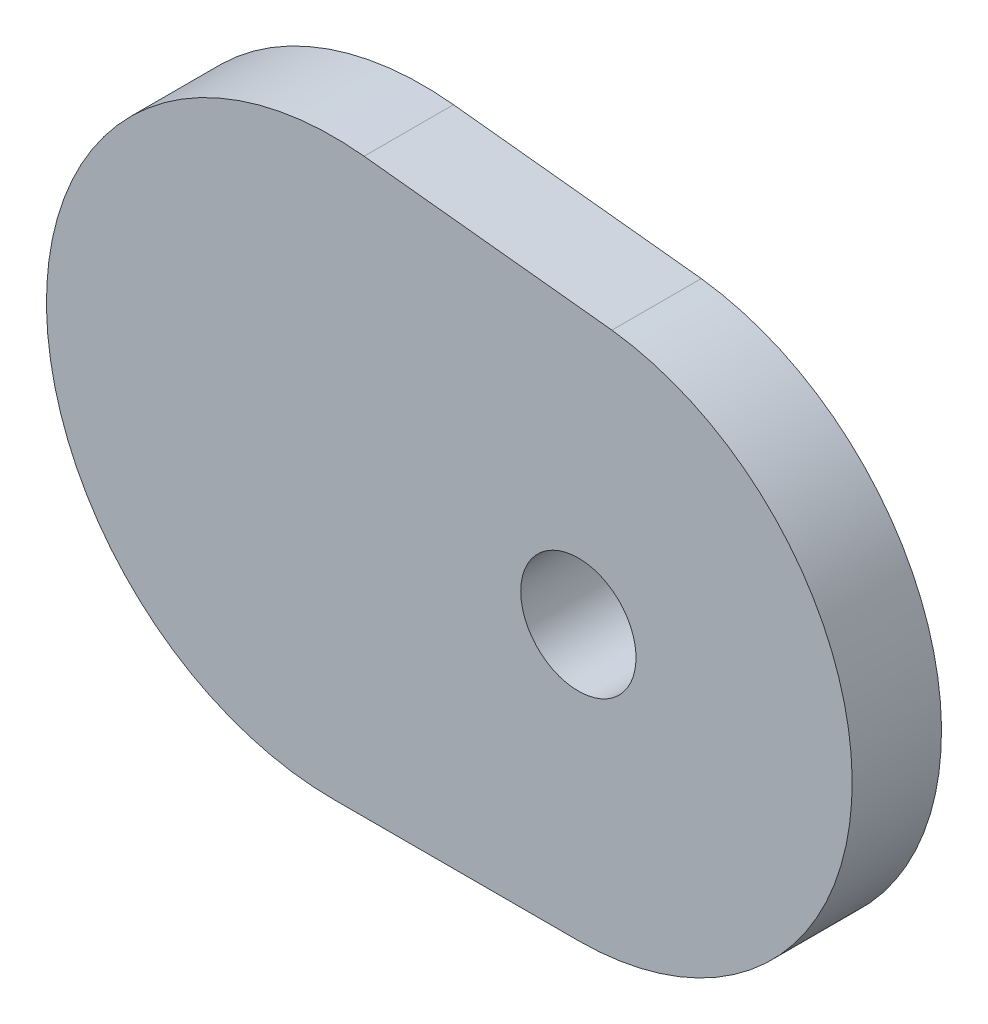
ISO-10303-21;
HEADER;
FILE_DESCRIPTION(('STEP AP214'),'2;1');
FILE_NAME('part.step','',(''),(''),'','','');
FILE_SCHEMA(('AUTOMOTIVE_DESIGN { 1 0 10303 214 1 1 1 1 }'));
ENDSEC;
DATA;
#1=APPLICATION_CONTEXT('core data for automotive mechanical design processes');
#2=APPLICATION_PROTOCOL_DEFINITION('international standard','automotive_design',2000,#1);
#3=PRODUCT_CONTEXT('',#1,'mechanical');
#4=PRODUCT('Part','Part','',(#3));
#5=PRODUCT_RELATED_PRODUCT_CATEGORY('part','',(#4));
#6=PRODUCT_DEFINITION_FORMATION('','',#4);
#7=PRODUCT_DEFINITION_CONTEXT('part definition',#1,'design');
#8=PRODUCT_DEFINITION('design','',#6,#7);
#9=PRODUCT_DEFINITION_SHAPE('','',#8);
#10=(LENGTH_UNIT() NAMED_UNIT(*) SI_UNIT(.MILLI.,.METRE.));
#11=(NAMED_UNIT(*) PLANE_ANGLE_UNIT() SI_UNIT($,.RADIAN.));
#12=(NAMED_UNIT(*) SI_UNIT($,.STERADIAN.) SOLID_ANGLE_UNIT());
#13=UNCERTAINTY_MEASURE_WITH_UNIT(LENGTH_MEASURE(1.E-05),#10,'distance_accuracy_value','');
#14=(GEOMETRIC_REPRESENTATION_CONTEXT(3) GLOBAL_UNCERTAINTY_ASSIGNED_CONTEXT((#13)) GLOBAL_UNIT_ASSIGNED_CONTEXT((#10,
#11,#12)) REPRESENTATION_CONTEXT('',''));
#15=CARTESIAN_POINT('',(0.,0.,0.));
#16=DIRECTION('',(0.,0.,1.));
#17=DIRECTION('',(1.,0.,0.));
#18=AXIS2_PLACEMENT_3D('',#15,#16,#17);
#19=CARTESIAN_POINT('',(-17.,0.911479987832477,6.2));
#20=DIRECTION('',(0.,0.,1.));
#21=DIRECTION('',(1.,0.,0.));
#22=AXIS2_PLACEMENT_3D('',#19,#20,#21);
#23=PLANE('',#22);
#24=CARTESIAN_POINT('',(-17.,0.911479987832477,6.2));
#25=DIRECTION('',(0.,0.,1.));
#26=DIRECTION('',(1.,0.,0.));
#27=AXIS2_PLACEMENT_3D('',#24,#25,#26);
#28=CIRCLE('',#27,19.9114800449304);
#29=CARTESIAN_POINT('',(-14.8682675571379,20.7085190184904,6.2));
#30=VERTEX_POINT('',#29);
#31=CARTESIAN_POINT('',(-16.9999999328395,-19.0000000568548,6.2));
#32=VERTEX_POINT('',#31);
#33=EDGE_CURVE('E84',#30,#32,#28,.T.);
#34=ORIENTED_EDGE('',*,*,#33,.T.);
#35=DIRECTION('',(1.,3.34338276079298E-09,0.));
#36=VECTOR('',#35,1.);
#37=CARTESIAN_POINT('',(-16.9999999328395,-19.0000000568548,6.2));
#38=LINE('',#37,#36);
#39=CARTESIAN_POINT('',(6.40861293547063E-08,-19.0000000000087,6.2));
#40=VERTEX_POINT('',#39);
#41=EDGE_CURVE('E79',#32,#40,#38,.T.);
#42=ORIENTED_EDGE('',*,*,#41,.T.);
#43=CARTESIAN_POINT('',(0.,0.,6.2));
#44=DIRECTION('',(0.,0.,1.));
#45=DIRECTION('',(1.,0.,0.));
#46=AXIS2_PLACEMENT_3D('',#43,#44,#45);
#47=CIRCLE('',#46,19.0000000000087);
#48=CARTESIAN_POINT('',(2.328256926281,18.8568083111969,6.2));
#49=VERTEX_POINT('',#48);
#50=EDGE_CURVE('E82',#40,#49,#47,.T.);
#51=ORIENTED_EDGE('',*,*,#50,.T.);
#52=DIRECTION('',(-0.994252510900446,0.107060471548363,0.));
#53=VECTOR('',#52,1.);
#54=CARTESIAN_POINT('',(2.328256926281,18.8568083111969,6.2));
#55=LINE('',#54,#53);
#56=EDGE_CURVE('E49',#49,#30,#55,.T.);
#57=ORIENTED_EDGE('',*,*,#56,.T.);
#58=EDGE_LOOP('',(#34,#42,#51,#57));
#59=FACE_BOUND('',#58,.T.);
#60=CARTESIAN_POINT('',(0.,0.,6.2));
#61=DIRECTION('',(0.,0.,1.));
#62=DIRECTION('',(1.,0.,0.));
#63=AXIS2_PLACEMENT_3D('',#60,#61,#62);
#64=CIRCLE('',#63,4.);
#65=CARTESIAN_POINT('',(-4.,0.,6.2));
#66=VERTEX_POINT('',#65);
#67=EDGE_CURVE('E99',#66,#66,#64,.T.);
#68=ORIENTED_EDGE('',*,*,#67,.F.);
#69=EDGE_LOOP('',(#68));
#70=FACE_BOUND('',#69,.T.);
#71=ADVANCED_FACE('F32',(#59,#70),#23,.T.);
#72=CARTESIAN_POINT('',(-17.,0.911479987832477,0.));
#73=DIRECTION('',(0.,0.,1.));
#74=DIRECTION('',(1.,0.,0.));
#75=AXIS2_PLACEMENT_3D('',#72,#73,#74);
#76=PLANE('',#75);
#77=CARTESIAN_POINT('',(-17.,0.911479987832477,0.));
#78=DIRECTION('',(0.,0.,1.));
#79=DIRECTION('',(1.,0.,0.));
#80=AXIS2_PLACEMENT_3D('',#77,#78,#79);
#81=CIRCLE('',#80,19.9114800449304);
#82=CARTESIAN_POINT('',(-14.8682675571379,20.7085190184904,0.));
#83=VERTEX_POINT('',#82);
#84=CARTESIAN_POINT('',(-16.9999999328395,-19.0000000568548,0.));
#85=VERTEX_POINT('',#84);
#86=EDGE_CURVE('E96',#83,#85,#81,.T.);
#87=ORIENTED_EDGE('',*,*,#86,.F.);
#88=DIRECTION('',(-0.994252510900446,0.107060471548363,0.));
#89=VECTOR('',#88,1.);
#90=CARTESIAN_POINT('',(2.328256926281,18.8568083111969,0.));
#91=LINE('',#90,#89);
#92=CARTESIAN_POINT('',(2.328256926281,18.8568083111969,0.));
#93=VERTEX_POINT('',#92);
#94=EDGE_CURVE('E72',#93,#83,#91,.T.);
#95=ORIENTED_EDGE('',*,*,#94,.F.);
#96=CARTESIAN_POINT('',(0.,0.,0.));
#97=DIRECTION('',(0.,0.,1.));
#98=DIRECTION('',(1.,0.,0.));
#99=AXIS2_PLACEMENT_3D('',#96,#97,#98);
#100=CIRCLE('',#99,19.0000000000087);
#101=CARTESIAN_POINT('',(6.40861293547063E-08,-19.0000000000087,0.));
#102=VERTEX_POINT('',#101);
#103=EDGE_CURVE('E66',#102,#93,#100,.T.);
#104=ORIENTED_EDGE('',*,*,#103,.F.);
#105=DIRECTION('',(1.,3.34338276079298E-09,0.));
#106=VECTOR('',#105,1.);
#107=CARTESIAN_POINT('',(-16.9999999328395,-19.0000000568548,0.));
#108=LINE('',#107,#106);
#109=EDGE_CURVE('E88',#85,#102,#108,.T.);
#110=ORIENTED_EDGE('',*,*,#109,.F.);
#111=EDGE_LOOP('',(#87,#95,#104,#110));
#112=FACE_BOUND('',#111,.T.);
#113=CARTESIAN_POINT('',(0.,0.,0.));
#114=DIRECTION('',(0.,0.,1.));
#115=DIRECTION('',(1.,0.,0.));
#116=AXIS2_PLACEMENT_3D('',#113,#114,#115);
#117=CIRCLE('',#116,4.);
#118=CARTESIAN_POINT('',(-4.,0.,0.));
#119=VERTEX_POINT('',#118);
#120=EDGE_CURVE('E111',#119,#119,#117,.T.);
#121=ORIENTED_EDGE('',*,*,#120,.T.);
#122=EDGE_LOOP('',(#121));
#123=FACE_BOUND('',#122,.T.);
#124=ADVANCED_FACE('F107',(#112,#123),#76,.F.);
#125=CARTESIAN_POINT('',(-17.,0.911479987832477,6.2));
#126=DIRECTION('',(0.,0.,-1.));
#127=DIRECTION('',(-1.,0.,0.));
#128=AXIS2_PLACEMENT_3D('',#125,#126,#127);
#129=CYLINDRICAL_SURFACE('',#128,19.9114800449304);
#130=ORIENTED_EDGE('',*,*,#86,.T.);
#131=DIRECTION('',(0.,0.,-1.));
#132=VECTOR('',#131,1.);
#133=CARTESIAN_POINT('',(-16.9999999328395,-19.0000000568548,6.2));
#134=LINE('',#133,#132);
#135=EDGE_CURVE('E11',#32,#85,#134,.T.);
#136=ORIENTED_EDGE('',*,*,#135,.F.);
#137=ORIENTED_EDGE('',*,*,#33,.F.);
#138=DIRECTION('',(0.,0.,-1.));
#139=VECTOR('',#138,1.);
#140=CARTESIAN_POINT('',(-14.8682675571379,20.7085190184904,6.2));
#141=LINE('',#140,#139);
#142=EDGE_CURVE('E92',#30,#83,#141,.T.);
#143=ORIENTED_EDGE('',*,*,#142,.T.);
#144=EDGE_LOOP('',(#130,#136,#137,#143));
#145=FACE_BOUND('',#144,.T.);
#146=ADVANCED_FACE('F34',(#145),#129,.T.);
#147=CARTESIAN_POINT('',(-16.9999999328395,-19.0000000568548,6.2));
#148=DIRECTION('',(-3.34338276079298E-09,1.,0.));
#149=DIRECTION('',(-1.,-3.34338276079298E-09,0.));
#150=AXIS2_PLACEMENT_3D('',#147,#148,#149);
#151=PLANE('',#150);
#152=ORIENTED_EDGE('',*,*,#109,.T.);
#153=DIRECTION('',(0.,0.,-1.));
#154=VECTOR('',#153,1.);
#155=CARTESIAN_POINT('',(6.40861293547063E-08,-19.0000000000087,6.2));
#156=LINE('',#155,#154);
#157=EDGE_CURVE('E41',#40,#102,#156,.T.);
#158=ORIENTED_EDGE('',*,*,#157,.F.);
#159=ORIENTED_EDGE('',*,*,#41,.F.);
#160=ORIENTED_EDGE('',*,*,#135,.T.);
#161=EDGE_LOOP('',(#152,#158,#159,#160));
#162=FACE_BOUND('',#161,.T.);
#163=ADVANCED_FACE('F87',(#162),#151,.F.);
#164=CARTESIAN_POINT('',(0.,0.,6.2));
#165=DIRECTION('',(0.,0.,-1.));
#166=DIRECTION('',(-1.,0.,0.));
#167=AXIS2_PLACEMENT_3D('',#164,#165,#166);
#168=CYLINDRICAL_SURFACE('',#167,19.0000000000087);
#169=ORIENTED_EDGE('',*,*,#103,.T.);
#170=DIRECTION('',(0.,0.,-1.));
#171=VECTOR('',#170,1.);
#172=CARTESIAN_POINT('',(2.328256926281,18.8568083111969,6.2));
#173=LINE('',#172,#171);
#174=EDGE_CURVE('E89',#49,#93,#173,.T.);
#175=ORIENTED_EDGE('',*,*,#174,.F.);
#176=ORIENTED_EDGE('',*,*,#50,.F.);
#177=ORIENTED_EDGE('',*,*,#157,.T.);
#178=EDGE_LOOP('',(#169,#175,#176,#177));
#179=FACE_BOUND('',#178,.T.);
#180=ADVANCED_FACE('F90',(#179),#168,.T.);
#181=CARTESIAN_POINT('',(2.328256926281,18.8568083111969,6.2));
#182=DIRECTION('',(-0.107060471548363,-0.994252510900446,0.));
#183=DIRECTION('',(0.994252510900446,-0.107060471548363,0.));
#184=AXIS2_PLACEMENT_3D('',#181,#182,#183);
#185=PLANE('',#184);
#186=ORIENTED_EDGE('',*,*,#94,.T.);
#187=ORIENTED_EDGE('',*,*,#142,.F.);
#188=ORIENTED_EDGE('',*,*,#56,.F.);
#189=ORIENTED_EDGE('',*,*,#174,.T.);
#190=EDGE_LOOP('',(#186,#187,#188,#189));
#191=FACE_BOUND('',#190,.T.);
#192=ADVANCED_FACE('F104',(#191),#185,.F.);
#193=CARTESIAN_POINT('',(0.,0.,6.2));
#194=DIRECTION('',(0.,0.,-1.));
#195=DIRECTION('',(-1.,0.,0.));
#196=AXIS2_PLACEMENT_3D('',#193,#194,#195);
#197=CYLINDRICAL_SURFACE('',#196,4.);
#198=CARTESIAN_POINT('',(-4.,0.,6.2));
#199=CARTESIAN_POINT('',(-4.,0.,6.13541666666667));
#200=CARTESIAN_POINT('',(-4.,0.,6.07083333333333));
#201=CARTESIAN_POINT('',(-4.,0.,5.94166666666667));
#202=CARTESIAN_POINT('',(-4.,0.,5.87708333333333));
#203=CARTESIAN_POINT('',(-4.,0.,5.74791666666667));
#204=CARTESIAN_POINT('',(-4.,0.,5.68333333333333));
#205=CARTESIAN_POINT('',(-4.,0.,5.55416666666667));
#206=CARTESIAN_POINT('',(-4.,0.,5.48958333333333));
#207=CARTESIAN_POINT('',(-4.,0.,5.36041666666667));
#208=CARTESIAN_POINT('',(-4.,0.,5.29583333333333));
#209=CARTESIAN_POINT('',(-4.,0.,5.16666666666667));
#210=CARTESIAN_POINT('',(-4.,0.,5.10208333333333));
#211=CARTESIAN_POINT('',(-4.,0.,4.97291666666667));
#212=CARTESIAN_POINT('',(-4.,0.,4.90833333333333));
#213=CARTESIAN_POINT('',(-4.,0.,4.77916666666667));
#214=CARTESIAN_POINT('',(-4.,0.,4.71458333333333));
#215=CARTESIAN_POINT('',(-4.,0.,4.58541666666667));
#216=CARTESIAN_POINT('',(-4.,0.,4.52083333333333));
#217=CARTESIAN_POINT('',(-4.,0.,4.39166666666667));
#218=CARTESIAN_POINT('',(-4.,0.,4.32708333333333));
#219=CARTESIAN_POINT('',(-4.,0.,4.19791666666667));
#220=CARTESIAN_POINT('',(-4.,0.,4.13333333333333));
#221=CARTESIAN_POINT('',(-4.,0.,4.00416666666667));
#222=CARTESIAN_POINT('',(-4.,0.,3.93958333333333));
#223=CARTESIAN_POINT('',(-4.,0.,3.81041666666667));
#224=CARTESIAN_POINT('',(-4.,0.,3.74583333333333));
#225=CARTESIAN_POINT('',(-4.,0.,3.61666666666667));
#226=CARTESIAN_POINT('',(-4.,0.,3.55208333333333));
#227=CARTESIAN_POINT('',(-4.,0.,3.42291666666667));
#228=CARTESIAN_POINT('',(-4.,0.,3.35833333333333));
#229=CARTESIAN_POINT('',(-4.,0.,3.22916666666667));
#230=CARTESIAN_POINT('',(-4.,0.,3.16458333333333));
#231=CARTESIAN_POINT('',(-4.,0.,3.03541666666667));
#232=CARTESIAN_POINT('',(-4.,0.,2.97083333333333));
#233=CARTESIAN_POINT('',(-4.,0.,2.84166666666667));
#234=CARTESIAN_POINT('',(-4.,0.,2.77708333333333));
#235=CARTESIAN_POINT('',(-4.,0.,2.64791666666667));
#236=CARTESIAN_POINT('',(-4.,0.,2.58333333333333));
#237=CARTESIAN_POINT('',(-4.,0.,2.45416666666667));
#238=CARTESIAN_POINT('',(-4.,0.,2.38958333333333));
#239=CARTESIAN_POINT('',(-4.,0.,2.26041666666667));
#240=CARTESIAN_POINT('',(-4.,0.,2.19583333333333));
#241=CARTESIAN_POINT('',(-4.,0.,2.06666666666667));
#242=CARTESIAN_POINT('',(-4.,0.,2.00208333333333));
#243=CARTESIAN_POINT('',(-4.,0.,1.87291666666667));
#244=CARTESIAN_POINT('',(-4.,0.,1.80833333333333));
#245=CARTESIAN_POINT('',(-4.,0.,1.67916666666667));
#246=CARTESIAN_POINT('',(-4.,0.,1.61458333333333));
#247=CARTESIAN_POINT('',(-4.,0.,1.48541666666667));
#248=CARTESIAN_POINT('',(-4.,0.,1.42083333333333));
#249=CARTESIAN_POINT('',(-4.,0.,1.29166666666667));
#250=CARTESIAN_POINT('',(-4.,0.,1.22708333333333));
#251=CARTESIAN_POINT('',(-4.,0.,1.09791666666667));
#252=CARTESIAN_POINT('',(-4.,0.,1.03333333333333));
#253=CARTESIAN_POINT('',(-4.,0.,0.904166666666667));
#254=CARTESIAN_POINT('',(-4.,0.,0.839583333333333));
#255=CARTESIAN_POINT('',(-4.,0.,0.710416666666666));
#256=CARTESIAN_POINT('',(-4.,0.,0.645833333333333));
#257=CARTESIAN_POINT('',(-4.,0.,0.516666666666667));
#258=CARTESIAN_POINT('',(-4.,0.,0.452083333333333));
#259=CARTESIAN_POINT('',(-4.,0.,0.322916666666667));
#260=CARTESIAN_POINT('',(-4.,0.,0.258333333333334));
#261=CARTESIAN_POINT('',(-4.,0.,0.129166666666667));
#262=CARTESIAN_POINT('',(-4.,0.,0.0645833333333335));
#263=CARTESIAN_POINT('',(-4.,0.,0.));
#264=B_SPLINE_CURVE_WITH_KNOTS('',3,(#198,#199,#200,#201,#202,#203,#204,#205,#206,#207,#208,
#209,#210,#211,#212,#213,#214,#215,#216,#217,#218,#219,#220,#221,#222,#223,#224,#225,#226,#227,
#228,#229,#230,#231,#232,#233,#234,#235,#236,#237,#238,#239,#240,#241,#242,#243,#244,#245,#246,
#247,#248,#249,#250,#251,#252,#253,#254,#255,#256,#257,#258,#259,#260,#261,#262,#263),
.UNSPECIFIED.,.F.,.F.,(4,2,2,2,2,2,2,2,2,2,2,2,2,2,2,2,2,2,2,2,2,2,2,2,2,2,2,2,2,2,2,2,4),(0.,
0.19375,0.387500000000001,0.58125,0.775,0.96875,1.1625,1.35625,1.55,1.74375,1.9375,2.13125,
2.325,2.51875,2.7125,2.90625,3.1,3.29375,3.4875,3.68125,3.875,4.06875,4.2625,4.45625,4.65,
4.84375,5.0375,5.23125,5.425,5.61875,5.8125,6.00625,6.2),.UNSPECIFIED.);
#265=EDGE_CURVE('BSEAM117',#66,#119,#264,.T.);
#266=ORIENTED_EDGE('',*,*,#67,.T.);
#267=ORIENTED_EDGE('',*,*,#120,.F.);
#268=ORIENTED_EDGE('',*,*,#265,.T.);
#269=ORIENTED_EDGE('',*,*,#265,.F.);
#270=EDGE_LOOP('',(#266,#268,#267,#269));
#271=FACE_BOUND('',#270,.T.);
#272=ADVANCED_FACE('F117',(#271),#197,.F.);
#273=CLOSED_SHELL('',(#71,#124,#146,#163,#180,#192,#272));
#274=MANIFOLD_SOLID_BREP('B2',#273);
#275=ADVANCED_BREP_SHAPE_REPRESENTATION('',(#18,#274),#14);
#276=SHAPE_DEFINITION_REPRESENTATION(#9,#275);
ENDSEC;
END-ISO-10303-21;
